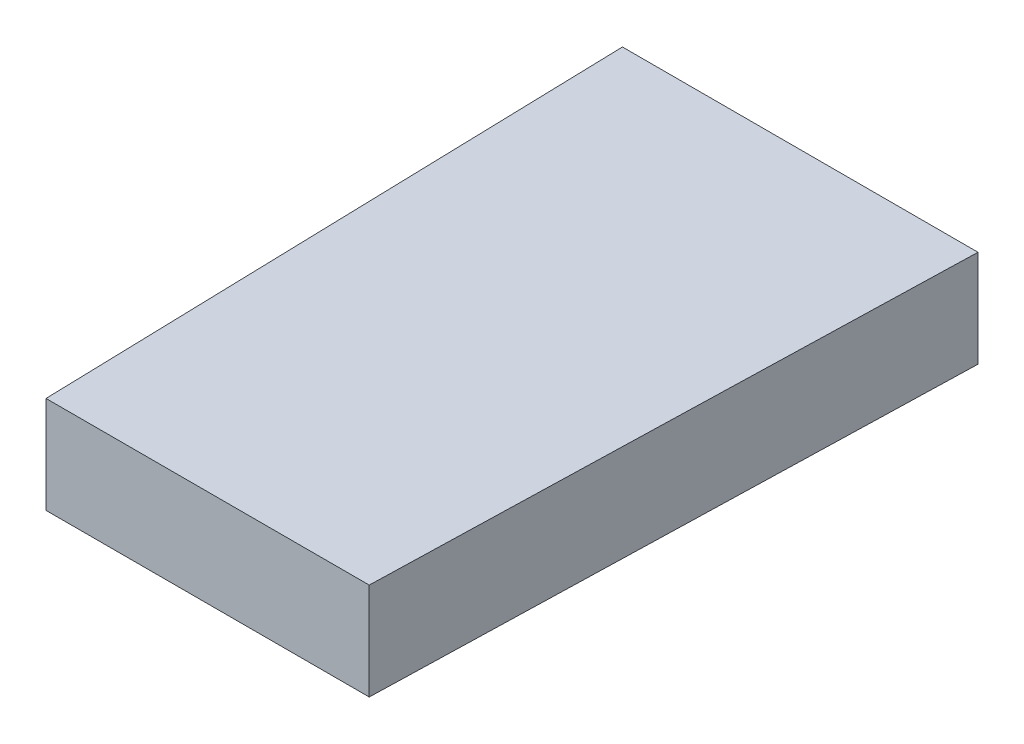
ISO-10303-21;
HEADER;
FILE_DESCRIPTION(('STEP AP214'),'2;1');
FILE_NAME('part.step','',(''),(''),'','','');
FILE_SCHEMA(('AUTOMOTIVE_DESIGN { 1 0 10303 214 1 1 1 1 }'));
ENDSEC;
DATA;
#1=APPLICATION_CONTEXT('core data for automotive mechanical design processes');
#2=APPLICATION_PROTOCOL_DEFINITION('international standard','automotive_design',2000,#1);
#3=PRODUCT_CONTEXT('',#1,'mechanical');
#4=PRODUCT('Part','Part','',(#3));
#5=PRODUCT_RELATED_PRODUCT_CATEGORY('part','',(#4));
#6=PRODUCT_DEFINITION_FORMATION('','',#4);
#7=PRODUCT_DEFINITION_CONTEXT('part definition',#1,'design');
#8=PRODUCT_DEFINITION('design','',#6,#7);
#9=PRODUCT_DEFINITION_SHAPE('','',#8);
#10=(LENGTH_UNIT() NAMED_UNIT(*) SI_UNIT(.MILLI.,.METRE.));
#11=(NAMED_UNIT(*) PLANE_ANGLE_UNIT() SI_UNIT($,.RADIAN.));
#12=(NAMED_UNIT(*) SI_UNIT($,.STERADIAN.) SOLID_ANGLE_UNIT());
#13=UNCERTAINTY_MEASURE_WITH_UNIT(LENGTH_MEASURE(1.E-05),#10,'distance_accuracy_value','');
#14=(GEOMETRIC_REPRESENTATION_CONTEXT(3) GLOBAL_UNCERTAINTY_ASSIGNED_CONTEXT((#13)) GLOBAL_UNIT_ASSIGNED_CONTEXT((#10,
#11,#12)) REPRESENTATION_CONTEXT('',''));
#15=CARTESIAN_POINT('',(0.,0.,0.));
#16=DIRECTION('',(0.,0.,1.));
#17=DIRECTION('',(1.,0.,0.));
#18=AXIS2_PLACEMENT_3D('',#15,#16,#17);
#19=CARTESIAN_POINT('',(16.5,4.5,-27.5));
#20=DIRECTION('',(0.,0.,1.));
#21=DIRECTION('',(1.,0.,0.));
#22=AXIS2_PLACEMENT_3D('',#19,#20,#21);
#23=PLANE('',#22);
#24=DIRECTION('',(-1.,0.,0.));
#25=VECTOR('',#24,1.);
#26=CARTESIAN_POINT('',(16.5,-4.5,-27.5));
#27=LINE('',#26,#25);
#28=CARTESIAN_POINT('',(16.5,-4.5,-27.5));
#29=VERTEX_POINT('',#28);
#30=CARTESIAN_POINT('',(-16.5,-4.5,-27.5));
#31=VERTEX_POINT('',#30);
#32=EDGE_CURVE('E99',#29,#31,#27,.T.);
#33=ORIENTED_EDGE('',*,*,#32,.T.);
#34=DIRECTION('',(0.,-1.,0.));
#35=VECTOR('',#34,1.);
#36=CARTESIAN_POINT('',(-16.5,4.5,-27.5));
#37=LINE('',#36,#35);
#38=CARTESIAN_POINT('',(-16.5,4.5,-27.5));
#39=VERTEX_POINT('',#38);
#40=EDGE_CURVE('E11',#39,#31,#37,.T.);
#41=ORIENTED_EDGE('',*,*,#40,.F.);
#42=DIRECTION('',(-1.,0.,0.));
#43=VECTOR('',#42,1.);
#44=CARTESIAN_POINT('',(16.5,4.5,-27.5));
#45=LINE('',#44,#43);
#46=CARTESIAN_POINT('',(16.5,4.5,-27.5));
#47=VERTEX_POINT('',#46);
#48=EDGE_CURVE('E87',#47,#39,#45,.T.);
#49=ORIENTED_EDGE('',*,*,#48,.F.);
#50=DIRECTION('',(0.,-1.,0.));
#51=VECTOR('',#50,1.);
#52=CARTESIAN_POINT('',(16.5,4.5,-27.5));
#53=LINE('',#52,#51);
#54=EDGE_CURVE('E95',#47,#29,#53,.T.);
#55=ORIENTED_EDGE('',*,*,#54,.T.);
#56=EDGE_LOOP('',(#33,#41,#49,#55));
#57=FACE_BOUND('',#56,.T.);
#58=ADVANCED_FACE('F36',(#57),#23,.F.);
#59=CARTESIAN_POINT('',(-16.5,4.5,-27.5));
#60=DIRECTION('',(0.99962830651038,0.,-0.0272625901775558));
#61=DIRECTION('',(-0.0272625901775559,0.,-0.99962830651038));
#62=AXIS2_PLACEMENT_3D('',#59,#60,#61);
#63=PLANE('',#62);
#64=DIRECTION('',(0.0272625901775558,0.,0.99962830651038));
#65=VECTOR('',#64,1.);
#66=CARTESIAN_POINT('',(-16.5,-4.5,-27.5));
#67=LINE('',#66,#65);
#68=CARTESIAN_POINT('',(-15.,-4.5,27.5));
#69=VERTEX_POINT('',#68);
#70=EDGE_CURVE('E91',#31,#69,#67,.T.);
#71=ORIENTED_EDGE('',*,*,#70,.T.);
#72=DIRECTION('',(0.,-1.,0.));
#73=VECTOR('',#72,1.);
#74=CARTESIAN_POINT('',(-15.,4.5,27.5));
#75=LINE('',#74,#73);
#76=CARTESIAN_POINT('',(-15.,4.5,27.5));
#77=VERTEX_POINT('',#76);
#78=EDGE_CURVE('E44',#77,#69,#75,.T.);
#79=ORIENTED_EDGE('',*,*,#78,.F.);
#80=DIRECTION('',(0.0272625901775558,0.,0.99962830651038));
#81=VECTOR('',#80,1.);
#82=CARTESIAN_POINT('',(-16.5,4.5,-27.5));
#83=LINE('',#82,#81);
#84=EDGE_CURVE('E82',#39,#77,#83,.T.);
#85=ORIENTED_EDGE('',*,*,#84,.F.);
#86=ORIENTED_EDGE('',*,*,#40,.T.);
#87=EDGE_LOOP('',(#71,#79,#85,#86));
#88=FACE_BOUND('',#87,.T.);
#89=ADVANCED_FACE('F90',(#88),#63,.F.);
#90=CARTESIAN_POINT('',(-15.,4.5,27.5));
#91=DIRECTION('',(0.,0.,-1.));
#92=DIRECTION('',(-1.,0.,0.));
#93=AXIS2_PLACEMENT_3D('',#90,#91,#92);
#94=PLANE('',#93);
#95=DIRECTION('',(1.,0.,0.));
#96=VECTOR('',#95,1.);
#97=CARTESIAN_POINT('',(-15.,-4.5,27.5));
#98=LINE('',#97,#96);
#99=CARTESIAN_POINT('',(15.,-4.5,27.5));
#100=VERTEX_POINT('',#99);
#101=EDGE_CURVE('E69',#69,#100,#98,.T.);
#102=ORIENTED_EDGE('',*,*,#101,.T.);
#103=DIRECTION('',(0.,-1.,0.));
#104=VECTOR('',#103,1.);
#105=CARTESIAN_POINT('',(15.,4.5,27.5));
#106=LINE('',#105,#104);
#107=CARTESIAN_POINT('',(15.,4.5,27.5));
#108=VERTEX_POINT('',#107);
#109=EDGE_CURVE('E92',#108,#100,#106,.T.);
#110=ORIENTED_EDGE('',*,*,#109,.F.);
#111=DIRECTION('',(1.,0.,0.));
#112=VECTOR('',#111,1.);
#113=CARTESIAN_POINT('',(-15.,4.5,27.5));
#114=LINE('',#113,#112);
#115=EDGE_CURVE('E85',#77,#108,#114,.T.);
#116=ORIENTED_EDGE('',*,*,#115,.F.);
#117=ORIENTED_EDGE('',*,*,#78,.T.);
#118=EDGE_LOOP('',(#102,#110,#116,#117));
#119=FACE_BOUND('',#118,.T.);
#120=ADVANCED_FACE('F93',(#119),#94,.F.);
#121=CARTESIAN_POINT('',(15.,4.5,27.5));
#122=DIRECTION('',(-0.99962830651038,0.,-0.0272625901775558));
#123=DIRECTION('',(-0.0272625901775559,0.,0.99962830651038));
#124=AXIS2_PLACEMENT_3D('',#121,#122,#123);
#125=PLANE('',#124);
#126=DIRECTION('',(0.0272625901775558,0.,-0.99962830651038));
#127=VECTOR('',#126,1.);
#128=CARTESIAN_POINT('',(15.,-4.5,27.5));
#129=LINE('',#128,#127);
#130=EDGE_CURVE('E75',#100,#29,#129,.T.);
#131=ORIENTED_EDGE('',*,*,#130,.T.);
#132=ORIENTED_EDGE('',*,*,#54,.F.);
#133=DIRECTION('',(0.0272625901775558,0.,-0.99962830651038));
#134=VECTOR('',#133,1.);
#135=CARTESIAN_POINT('',(15.,4.5,27.5));
#136=LINE('',#135,#134);
#137=EDGE_CURVE('E52',#108,#47,#136,.T.);
#138=ORIENTED_EDGE('',*,*,#137,.F.);
#139=ORIENTED_EDGE('',*,*,#109,.T.);
#140=EDGE_LOOP('',(#131,#132,#138,#139));
#141=FACE_BOUND('',#140,.T.);
#142=ADVANCED_FACE('F106',(#141),#125,.F.);
#143=CARTESIAN_POINT('',(0.,4.5,0.));
#144=DIRECTION('',(0.,1.,0.));
#145=DIRECTION('',(0.,0.,1.));
#146=AXIS2_PLACEMENT_3D('',#143,#144,#145);
#147=PLANE('',#146);
#148=ORIENTED_EDGE('',*,*,#48,.T.);
#149=ORIENTED_EDGE('',*,*,#84,.T.);
#150=ORIENTED_EDGE('',*,*,#115,.T.);
#151=ORIENTED_EDGE('',*,*,#137,.T.);
#152=EDGE_LOOP('',(#148,#149,#150,#151));
#153=FACE_BOUND('',#152,.T.);
#154=ADVANCED_FACE('F83',(#153),#147,.T.);
#155=CARTESIAN_POINT('',(0.,-4.5,0.));
#156=DIRECTION('',(0.,1.,0.));
#157=DIRECTION('',(0.,0.,1.));
#158=AXIS2_PLACEMENT_3D('',#155,#156,#157);
#159=PLANE('',#158);
#160=ORIENTED_EDGE('',*,*,#32,.F.);
#161=ORIENTED_EDGE('',*,*,#130,.F.);
#162=ORIENTED_EDGE('',*,*,#101,.F.);
#163=ORIENTED_EDGE('',*,*,#70,.F.);
#164=EDGE_LOOP('',(#160,#161,#162,#163));
#165=FACE_BOUND('',#164,.T.);
#166=ADVANCED_FACE('F109',(#165),#159,.F.);
#167=CLOSED_SHELL('',(#58,#89,#120,#142,#154,#166));
#168=MANIFOLD_SOLID_BREP('B2',#167);
#169=ADVANCED_BREP_SHAPE_REPRESENTATION('',(#18,#168),#14);
#170=SHAPE_DEFINITION_REPRESENTATION(#9,#169);
ENDSEC;
END-ISO-10303-21;
